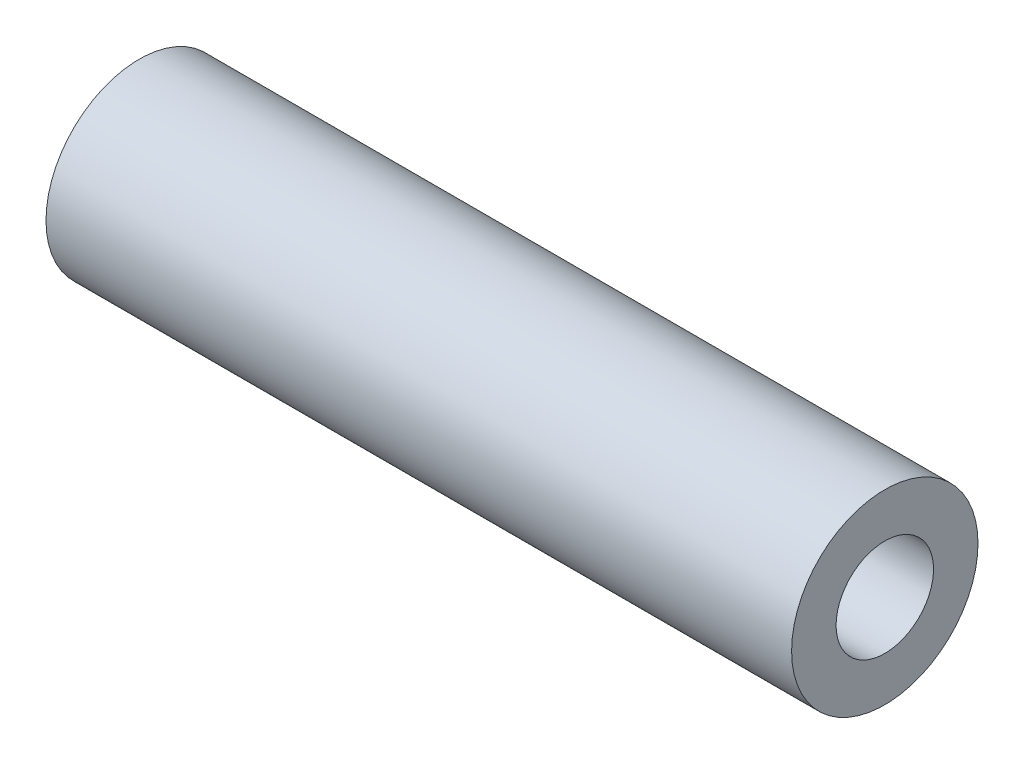
ISO-10303-21;
HEADER;
FILE_DESCRIPTION(('STEP AP214'),'2;1');
FILE_NAME('part.step','',(''),(''),'','','');
FILE_SCHEMA(('AUTOMOTIVE_DESIGN { 1 0 10303 214 1 1 1 1 }'));
ENDSEC;
DATA;
#1=APPLICATION_CONTEXT('core data for automotive mechanical design processes');
#2=APPLICATION_PROTOCOL_DEFINITION('international standard','automotive_design',2000,#1);
#3=PRODUCT_CONTEXT('',#1,'mechanical');
#4=PRODUCT('Part','Part','',(#3));
#5=PRODUCT_RELATED_PRODUCT_CATEGORY('part','',(#4));
#6=PRODUCT_DEFINITION_FORMATION('','',#4);
#7=PRODUCT_DEFINITION_CONTEXT('part definition',#1,'design');
#8=PRODUCT_DEFINITION('design','',#6,#7);
#9=PRODUCT_DEFINITION_SHAPE('','',#8);
#10=(LENGTH_UNIT() NAMED_UNIT(*) SI_UNIT(.MILLI.,.METRE.));
#11=(NAMED_UNIT(*) PLANE_ANGLE_UNIT() SI_UNIT($,.RADIAN.));
#12=(NAMED_UNIT(*) SI_UNIT($,.STERADIAN.) SOLID_ANGLE_UNIT());
#13=UNCERTAINTY_MEASURE_WITH_UNIT(LENGTH_MEASURE(1.E-05),#10,'distance_accuracy_value','');
#14=(GEOMETRIC_REPRESENTATION_CONTEXT(3) GLOBAL_UNCERTAINTY_ASSIGNED_CONTEXT((#13)) GLOBAL_UNIT_ASSIGNED_CONTEXT((#10,
#11,#12)) REPRESENTATION_CONTEXT('',''));
#15=CARTESIAN_POINT('',(0.,0.,0.));
#16=DIRECTION('',(0.,0.,1.));
#17=DIRECTION('',(1.,0.,0.));
#18=AXIS2_PLACEMENT_3D('',#15,#16,#17);
#19=CARTESIAN_POINT('',(19.05,0.,0.));
#20=DIRECTION('',(1.,0.,0.));
#21=DIRECTION('',(0.,0.,-1.));
#22=AXIS2_PLACEMENT_3D('',#19,#20,#21);
#23=PLANE('',#22);
#24=CARTESIAN_POINT('',(19.05,0.,0.));
#25=DIRECTION('',(1.,0.,0.));
#26=DIRECTION('',(0.,0.,-1.));
#27=AXIS2_PLACEMENT_3D('',#24,#25,#26);
#28=CIRCLE('',#27,4.7625);
#29=CARTESIAN_POINT('',(19.05,0.,4.7625));
#30=VERTEX_POINT('',#29);
#31=EDGE_CURVE('E10',#30,#30,#28,.T.);
#32=ORIENTED_EDGE('',*,*,#31,.T.);
#33=EDGE_LOOP('',(#32));
#34=FACE_BOUND('',#33,.T.);
#35=CARTESIAN_POINT('',(19.05,0.,0.));
#36=DIRECTION('',(1.,0.,0.));
#37=DIRECTION('',(0.,0.,-1.));
#38=AXIS2_PLACEMENT_3D('',#35,#36,#37);
#39=CIRCLE('',#38,2.4892);
#40=CARTESIAN_POINT('',(19.05,0.,2.4892));
#41=VERTEX_POINT('',#40);
#42=EDGE_CURVE('E46',#41,#41,#39,.T.);
#43=ORIENTED_EDGE('',*,*,#42,.F.);
#44=EDGE_LOOP('',(#43));
#45=FACE_BOUND('',#44,.T.);
#46=ADVANCED_FACE('F35',(#34,#45),#23,.T.);
#47=CARTESIAN_POINT('',(-19.05,0.,0.));
#48=DIRECTION('',(1.,0.,0.));
#49=DIRECTION('',(0.,0.,-1.));
#50=AXIS2_PLACEMENT_3D('',#47,#48,#49);
#51=PLANE('',#50);
#52=CARTESIAN_POINT('',(-19.05,0.,0.));
#53=DIRECTION('',(1.,0.,0.));
#54=DIRECTION('',(0.,0.,-1.));
#55=AXIS2_PLACEMENT_3D('',#52,#53,#54);
#56=CIRCLE('',#55,4.7625);
#57=CARTESIAN_POINT('',(-19.05,0.,4.7625));
#58=VERTEX_POINT('',#57);
#59=EDGE_CURVE('E39',#58,#58,#56,.T.);
#60=ORIENTED_EDGE('',*,*,#59,.F.);
#61=EDGE_LOOP('',(#60));
#62=FACE_BOUND('',#61,.T.);
#63=CARTESIAN_POINT('',(-19.05,0.,0.));
#64=DIRECTION('',(1.,0.,0.));
#65=DIRECTION('',(0.,0.,-1.));
#66=AXIS2_PLACEMENT_3D('',#63,#64,#65);
#67=CIRCLE('',#66,2.4892);
#68=CARTESIAN_POINT('',(-19.05,0.,2.4892));
#69=VERTEX_POINT('',#68);
#70=EDGE_CURVE('E48',#69,#69,#67,.T.);
#71=ORIENTED_EDGE('',*,*,#70,.T.);
#72=EDGE_LOOP('',(#71));
#73=FACE_BOUND('',#72,.T.);
#74=ADVANCED_FACE('F58',(#62,#73),#51,.F.);
#75=CARTESIAN_POINT('',(19.05,0.,0.));
#76=DIRECTION('',(-1.,0.,0.));
#77=DIRECTION('',(0.,0.,1.));
#78=AXIS2_PLACEMENT_3D('',#75,#76,#77);
#79=CYLINDRICAL_SURFACE('',#78,4.7625);
#80=CARTESIAN_POINT('',(19.05,0.,4.7625));
#81=CARTESIAN_POINT('',(18.653125,0.,4.7625));
#82=CARTESIAN_POINT('',(18.25625,0.,4.7625));
#83=CARTESIAN_POINT('',(17.4625,0.,4.7625));
#84=CARTESIAN_POINT('',(17.065625,0.,4.7625));
#85=CARTESIAN_POINT('',(16.271875,0.,4.7625));
#86=CARTESIAN_POINT('',(15.875,0.,4.7625));
#87=CARTESIAN_POINT('',(15.08125,0.,4.7625));
#88=CARTESIAN_POINT('',(14.684375,0.,4.7625));
#89=CARTESIAN_POINT('',(13.890625,0.,4.7625));
#90=CARTESIAN_POINT('',(13.49375,0.,4.7625));
#91=CARTESIAN_POINT('',(12.7,0.,4.7625));
#92=CARTESIAN_POINT('',(12.303125,0.,4.7625));
#93=CARTESIAN_POINT('',(11.509375,0.,4.7625));
#94=CARTESIAN_POINT('',(11.1125,0.,4.7625));
#95=CARTESIAN_POINT('',(10.31875,0.,4.7625));
#96=CARTESIAN_POINT('',(9.921875,0.,4.7625));
#97=CARTESIAN_POINT('',(9.128125,0.,4.7625));
#98=CARTESIAN_POINT('',(8.73125,0.,4.7625));
#99=CARTESIAN_POINT('',(7.9375,0.,4.7625));
#100=CARTESIAN_POINT('',(7.540625,0.,4.7625));
#101=CARTESIAN_POINT('',(6.746875,0.,4.7625));
#102=CARTESIAN_POINT('',(6.35,0.,4.7625));
#103=CARTESIAN_POINT('',(5.55625,0.,4.7625));
#104=CARTESIAN_POINT('',(5.159375,0.,4.7625));
#105=CARTESIAN_POINT('',(4.365625,0.,4.7625));
#106=CARTESIAN_POINT('',(3.96875,0.,4.7625));
#107=CARTESIAN_POINT('',(3.175,0.,4.7625));
#108=CARTESIAN_POINT('',(2.778125,0.,4.7625));
#109=CARTESIAN_POINT('',(1.984375,0.,4.7625));
#110=CARTESIAN_POINT('',(1.5875,0.,4.7625));
#111=CARTESIAN_POINT('',(0.79375,0.,4.7625));
#112=CARTESIAN_POINT('',(0.396875,0.,4.7625));
#113=CARTESIAN_POINT('',(-0.396875,0.,4.7625));
#114=CARTESIAN_POINT('',(-0.79375,0.,4.7625));
#115=CARTESIAN_POINT('',(-1.5875,0.,4.7625));
#116=CARTESIAN_POINT('',(-1.984375,0.,4.7625));
#117=CARTESIAN_POINT('',(-2.778125,0.,4.7625));
#118=CARTESIAN_POINT('',(-3.175,0.,4.7625));
#119=CARTESIAN_POINT('',(-3.96875,0.,4.7625));
#120=CARTESIAN_POINT('',(-4.365625,0.,4.7625));
#121=CARTESIAN_POINT('',(-5.159375,0.,4.7625));
#122=CARTESIAN_POINT('',(-5.55625,0.,4.7625));
#123=CARTESIAN_POINT('',(-6.35,0.,4.7625));
#124=CARTESIAN_POINT('',(-6.746875,0.,4.7625));
#125=CARTESIAN_POINT('',(-7.540625,0.,4.7625));
#126=CARTESIAN_POINT('',(-7.9375,0.,4.7625));
#127=CARTESIAN_POINT('',(-8.73125,0.,4.7625));
#128=CARTESIAN_POINT('',(-9.128125,0.,4.7625));
#129=CARTESIAN_POINT('',(-9.921875,0.,4.7625));
#130=CARTESIAN_POINT('',(-10.31875,0.,4.7625));
#131=CARTESIAN_POINT('',(-11.1125,0.,4.7625));
#132=CARTESIAN_POINT('',(-11.509375,0.,4.7625));
#133=CARTESIAN_POINT('',(-12.303125,0.,4.7625));
#134=CARTESIAN_POINT('',(-12.7,0.,4.7625));
#135=CARTESIAN_POINT('',(-13.49375,0.,4.7625));
#136=CARTESIAN_POINT('',(-13.890625,0.,4.7625));
#137=CARTESIAN_POINT('',(-14.684375,0.,4.7625));
#138=CARTESIAN_POINT('',(-15.08125,0.,4.7625));
#139=CARTESIAN_POINT('',(-15.875,0.,4.7625));
#140=CARTESIAN_POINT('',(-16.271875,0.,4.7625));
#141=CARTESIAN_POINT('',(-17.065625,0.,4.7625));
#142=CARTESIAN_POINT('',(-17.4625,0.,4.7625));
#143=CARTESIAN_POINT('',(-18.25625,0.,4.7625));
#144=CARTESIAN_POINT('',(-18.653125,0.,4.7625));
#145=CARTESIAN_POINT('',(-19.05,0.,4.7625));
#146=B_SPLINE_CURVE_WITH_KNOTS('',3,(#80,#81,#82,#83,#84,#85,#86,#87,#88,#89,#90,#91,#92,#93,
#94,#95,#96,#97,#98,#99,#100,#101,#102,#103,#104,#105,#106,#107,#108,#109,#110,#111,#112,#113,
#114,#115,#116,#117,#118,#119,#120,#121,#122,#123,#124,#125,#126,#127,#128,#129,#130,#131,#132,
#133,#134,#135,#136,#137,#138,#139,#140,#141,#142,#143,#144,#145),.UNSPECIFIED.,.F.,.F.,(4,2,2,
2,2,2,2,2,2,2,2,2,2,2,2,2,2,2,2,2,2,2,2,2,2,2,2,2,2,2,2,2,4),(0.,1.190625,2.38125,3.571875,
4.7625,5.953125,7.14375,8.334375,9.525,10.715625,11.90625,13.096875,14.2875,15.478125,16.66875,
17.859375,19.05,20.240625,21.43125,22.621875,23.8125,25.003125,26.19375,27.384375,28.575,
29.765625,30.95625,32.146875,33.3375,34.528125,35.71875,36.909375,38.1),.UNSPECIFIED.);
#147=EDGE_CURVE('BSEAM37',#30,#58,#146,.T.);
#148=ORIENTED_EDGE('',*,*,#31,.F.);
#149=ORIENTED_EDGE('',*,*,#59,.T.);
#150=ORIENTED_EDGE('',*,*,#147,.T.);
#151=ORIENTED_EDGE('',*,*,#147,.F.);
#152=EDGE_LOOP('',(#148,#150,#149,#151));
#153=FACE_BOUND('',#152,.T.);
#154=ADVANCED_FACE('F37',(#153),#79,.T.);
#155=CARTESIAN_POINT('',(19.05,0.,0.));
#156=DIRECTION('',(-1.,0.,0.));
#157=DIRECTION('',(0.,0.,1.));
#158=AXIS2_PLACEMENT_3D('',#155,#156,#157);
#159=CYLINDRICAL_SURFACE('',#158,2.4892);
#160=CARTESIAN_POINT('',(19.05,0.,2.4892));
#161=CARTESIAN_POINT('',(18.653125,0.,2.4892));
#162=CARTESIAN_POINT('',(18.25625,0.,2.4892));
#163=CARTESIAN_POINT('',(17.4625,0.,2.4892));
#164=CARTESIAN_POINT('',(17.065625,0.,2.4892));
#165=CARTESIAN_POINT('',(16.271875,0.,2.4892));
#166=CARTESIAN_POINT('',(15.875,0.,2.4892));
#167=CARTESIAN_POINT('',(15.08125,0.,2.4892));
#168=CARTESIAN_POINT('',(14.684375,0.,2.4892));
#169=CARTESIAN_POINT('',(13.890625,0.,2.4892));
#170=CARTESIAN_POINT('',(13.49375,0.,2.4892));
#171=CARTESIAN_POINT('',(12.7,0.,2.4892));
#172=CARTESIAN_POINT('',(12.303125,0.,2.4892));
#173=CARTESIAN_POINT('',(11.509375,0.,2.4892));
#174=CARTESIAN_POINT('',(11.1125,0.,2.4892));
#175=CARTESIAN_POINT('',(10.31875,0.,2.4892));
#176=CARTESIAN_POINT('',(9.921875,0.,2.4892));
#177=CARTESIAN_POINT('',(9.128125,0.,2.4892));
#178=CARTESIAN_POINT('',(8.73125,0.,2.4892));
#179=CARTESIAN_POINT('',(7.9375,0.,2.4892));
#180=CARTESIAN_POINT('',(7.540625,0.,2.4892));
#181=CARTESIAN_POINT('',(6.746875,0.,2.4892));
#182=CARTESIAN_POINT('',(6.35,0.,2.4892));
#183=CARTESIAN_POINT('',(5.55625,0.,2.4892));
#184=CARTESIAN_POINT('',(5.159375,0.,2.4892));
#185=CARTESIAN_POINT('',(4.365625,0.,2.4892));
#186=CARTESIAN_POINT('',(3.96875,0.,2.4892));
#187=CARTESIAN_POINT('',(3.175,0.,2.4892));
#188=CARTESIAN_POINT('',(2.778125,0.,2.4892));
#189=CARTESIAN_POINT('',(1.984375,0.,2.4892));
#190=CARTESIAN_POINT('',(1.5875,0.,2.4892));
#191=CARTESIAN_POINT('',(0.79375,0.,2.4892));
#192=CARTESIAN_POINT('',(0.396875,0.,2.4892));
#193=CARTESIAN_POINT('',(-0.396875,0.,2.4892));
#194=CARTESIAN_POINT('',(-0.79375,0.,2.4892));
#195=CARTESIAN_POINT('',(-1.5875,0.,2.4892));
#196=CARTESIAN_POINT('',(-1.984375,0.,2.4892));
#197=CARTESIAN_POINT('',(-2.778125,0.,2.4892));
#198=CARTESIAN_POINT('',(-3.175,0.,2.4892));
#199=CARTESIAN_POINT('',(-3.96875,0.,2.4892));
#200=CARTESIAN_POINT('',(-4.365625,0.,2.4892));
#201=CARTESIAN_POINT('',(-5.159375,0.,2.4892));
#202=CARTESIAN_POINT('',(-5.55625,0.,2.4892));
#203=CARTESIAN_POINT('',(-6.35,0.,2.4892));
#204=CARTESIAN_POINT('',(-6.746875,0.,2.4892));
#205=CARTESIAN_POINT('',(-7.540625,0.,2.4892));
#206=CARTESIAN_POINT('',(-7.9375,0.,2.4892));
#207=CARTESIAN_POINT('',(-8.73125,0.,2.4892));
#208=CARTESIAN_POINT('',(-9.128125,0.,2.4892));
#209=CARTESIAN_POINT('',(-9.921875,0.,2.4892));
#210=CARTESIAN_POINT('',(-10.31875,0.,2.4892));
#211=CARTESIAN_POINT('',(-11.1125,0.,2.4892));
#212=CARTESIAN_POINT('',(-11.509375,0.,2.4892));
#213=CARTESIAN_POINT('',(-12.303125,0.,2.4892));
#214=CARTESIAN_POINT('',(-12.7,0.,2.4892));
#215=CARTESIAN_POINT('',(-13.49375,0.,2.4892));
#216=CARTESIAN_POINT('',(-13.890625,0.,2.4892));
#217=CARTESIAN_POINT('',(-14.684375,0.,2.4892));
#218=CARTESIAN_POINT('',(-15.08125,0.,2.4892));
#219=CARTESIAN_POINT('',(-15.875,0.,2.4892));
#220=CARTESIAN_POINT('',(-16.271875,0.,2.4892));
#221=CARTESIAN_POINT('',(-17.065625,0.,2.4892));
#222=CARTESIAN_POINT('',(-17.4625,0.,2.4892));
#223=CARTESIAN_POINT('',(-18.25625,0.,2.4892));
#224=CARTESIAN_POINT('',(-18.653125,0.,2.4892));
#225=CARTESIAN_POINT('',(-19.05,0.,2.4892));
#226=B_SPLINE_CURVE_WITH_KNOTS('',3,(#160,#161,#162,#163,#164,#165,#166,#167,#168,#169,#170,
#171,#172,#173,#174,#175,#176,#177,#178,#179,#180,#181,#182,#183,#184,#185,#186,#187,#188,#189,
#190,#191,#192,#193,#194,#195,#196,#197,#198,#199,#200,#201,#202,#203,#204,#205,#206,#207,#208,
#209,#210,#211,#212,#213,#214,#215,#216,#217,#218,#219,#220,#221,#222,#223,#224,#225),
.UNSPECIFIED.,.F.,.F.,(4,2,2,2,2,2,2,2,2,2,2,2,2,2,2,2,2,2,2,2,2,2,2,2,2,2,2,2,2,2,2,2,4),(0.,
1.190625,2.38125,3.571875,4.7625,5.953125,7.14375,8.334375,9.525,10.715625,11.90625,13.096875,
14.2875,15.478125,16.66875,17.859375,19.05,20.240625,21.43125,22.621875,23.8125,25.003125,
26.19375,27.384375,28.575,29.765625,30.95625,32.146875,33.3375,34.528125,35.71875,36.909375,
38.1),.UNSPECIFIED.);
#227=EDGE_CURVE('BSEAM54',#41,#69,#226,.T.);
#228=ORIENTED_EDGE('',*,*,#42,.T.);
#229=ORIENTED_EDGE('',*,*,#70,.F.);
#230=ORIENTED_EDGE('',*,*,#227,.T.);
#231=ORIENTED_EDGE('',*,*,#227,.F.);
#232=EDGE_LOOP('',(#228,#230,#229,#231));
#233=FACE_BOUND('',#232,.T.);
#234=ADVANCED_FACE('F54',(#233),#159,.F.);
#235=CLOSED_SHELL('',(#46,#74,#154,#234));
#236=MANIFOLD_SOLID_BREP('B2',#235);
#237=ADVANCED_BREP_SHAPE_REPRESENTATION('',(#18,#236),#14);
#238=SHAPE_DEFINITION_REPRESENTATION(#9,#237);
ENDSEC;
END-ISO-10303-21;
